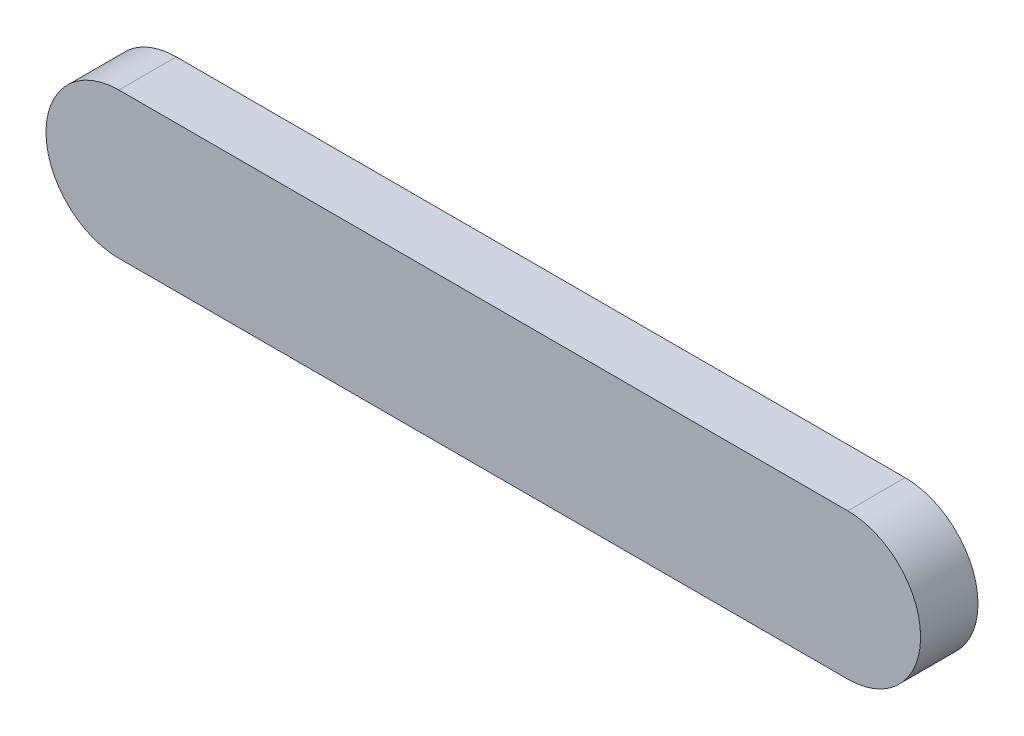
ISO-10303-21;
HEADER;
FILE_DESCRIPTION(('STEP AP214'),'2;1');
FILE_NAME('part.step','',(''),(''),'','','');
FILE_SCHEMA(('AUTOMOTIVE_DESIGN { 1 0 10303 214 1 1 1 1 }'));
ENDSEC;
DATA;
#1=APPLICATION_CONTEXT('core data for automotive mechanical design processes');
#2=APPLICATION_PROTOCOL_DEFINITION('international standard','automotive_design',2000,#1);
#3=PRODUCT_CONTEXT('',#1,'mechanical');
#4=PRODUCT('Part','Part','',(#3));
#5=PRODUCT_RELATED_PRODUCT_CATEGORY('part','',(#4));
#6=PRODUCT_DEFINITION_FORMATION('','',#4);
#7=PRODUCT_DEFINITION_CONTEXT('part definition',#1,'design');
#8=PRODUCT_DEFINITION('design','',#6,#7);
#9=PRODUCT_DEFINITION_SHAPE('','',#8);
#10=(LENGTH_UNIT() NAMED_UNIT(*) SI_UNIT(.MILLI.,.METRE.));
#11=(NAMED_UNIT(*) PLANE_ANGLE_UNIT() SI_UNIT($,.RADIAN.));
#12=(NAMED_UNIT(*) SI_UNIT($,.STERADIAN.) SOLID_ANGLE_UNIT());
#13=UNCERTAINTY_MEASURE_WITH_UNIT(LENGTH_MEASURE(1.E-05),#10,'distance_accuracy_value','');
#14=(GEOMETRIC_REPRESENTATION_CONTEXT(3) GLOBAL_UNCERTAINTY_ASSIGNED_CONTEXT((#13)) GLOBAL_UNIT_ASSIGNED_CONTEXT((#10,
#11,#12)) REPRESENTATION_CONTEXT('',''));
#15=CARTESIAN_POINT('',(0.,0.,0.));
#16=DIRECTION('',(0.,0.,1.));
#17=DIRECTION('',(1.,0.,0.));
#18=AXIS2_PLACEMENT_3D('',#15,#16,#17);
#19=CARTESIAN_POINT('',(92.64836944,66.04,0.));
#20=DIRECTION('',(0.,1.,0.));
#21=DIRECTION('',(1.,0.,0.));
#22=AXIS2_PLACEMENT_3D('',#19,#20,#21);
#23=PLANE('',#22);
#24=DIRECTION('',(1.,0.,0.));
#25=VECTOR('',#24,1.);
#26=CARTESIAN_POINT('',(92.64836944,66.04,0.1999996));
#27=LINE('',#26,#25);
#28=CARTESIAN_POINT('',(92.64836944,66.04,0.1999996));
#29=VERTEX_POINT('',#28);
#30=CARTESIAN_POINT('',(95.18836944,66.04,0.1999996));
#31=VERTEX_POINT('',#30);
#32=EDGE_CURVE('E11',#29,#31,#27,.T.);
#33=ORIENTED_EDGE('',*,*,#32,.F.);
#34=DIRECTION('',(0.,0.,1.));
#35=VECTOR('',#34,1.);
#36=CARTESIAN_POINT('',(92.64836944,66.04,0.));
#37=LINE('',#36,#35);
#38=CARTESIAN_POINT('',(92.64836944,66.04,0.));
#39=VERTEX_POINT('',#38);
#40=EDGE_CURVE('E24',#39,#29,#37,.T.);
#41=ORIENTED_EDGE('',*,*,#40,.F.);
#42=DIRECTION('',(1.,0.,0.));
#43=VECTOR('',#42,1.);
#44=CARTESIAN_POINT('',(92.64836944,66.04,0.));
#45=LINE('',#44,#43);
#46=CARTESIAN_POINT('',(95.18836944,66.04,0.));
#47=VERTEX_POINT('',#46);
#48=EDGE_CURVE('E75',#39,#47,#45,.T.);
#49=ORIENTED_EDGE('',*,*,#48,.T.);
#50=DIRECTION('',(0.,0.,1.));
#51=VECTOR('',#50,1.);
#52=CARTESIAN_POINT('',(95.18836944,66.04,0.));
#53=LINE('',#52,#51);
#54=EDGE_CURVE('E37',#47,#31,#53,.T.);
#55=ORIENTED_EDGE('',*,*,#54,.T.);
#56=EDGE_LOOP('',(#33,#41,#49,#55));
#57=FACE_BOUND('',#56,.T.);
#58=ADVANCED_FACE('F17',(#57),#23,.F.);
#59=CARTESIAN_POINT('',(95.18836944,66.294,0.));
#60=DIRECTION('',(0.,0.,-1.));
#61=DIRECTION('',(0.,-1.,0.));
#62=AXIS2_PLACEMENT_3D('',#59,#60,#61);
#63=CYLINDRICAL_SURFACE('',#62,0.254);
#64=CARTESIAN_POINT('',(95.18836944,66.294,0.1999996));
#65=DIRECTION('',(0.,0.,1.));
#66=DIRECTION('',(0.,-1.,0.));
#67=AXIS2_PLACEMENT_3D('',#64,#65,#66);
#68=CIRCLE('',#67,0.254);
#69=CARTESIAN_POINT('',(95.18836944,66.548,0.1999996));
#70=VERTEX_POINT('',#69);
#71=EDGE_CURVE('E83',#31,#70,#68,.T.);
#72=ORIENTED_EDGE('',*,*,#71,.F.);
#73=ORIENTED_EDGE('',*,*,#54,.F.);
#74=CARTESIAN_POINT('',(95.18836944,66.294,0.));
#75=DIRECTION('',(0.,0.,1.));
#76=DIRECTION('',(0.,-1.,0.));
#77=AXIS2_PLACEMENT_3D('',#74,#75,#76);
#78=CIRCLE('',#77,0.254);
#79=CARTESIAN_POINT('',(95.18836944,66.548,0.));
#80=VERTEX_POINT('',#79);
#81=EDGE_CURVE('E81',#47,#80,#78,.T.);
#82=ORIENTED_EDGE('',*,*,#81,.T.);
#83=DIRECTION('',(0.,0.,1.));
#84=VECTOR('',#83,1.);
#85=CARTESIAN_POINT('',(95.18836944,66.548,0.));
#86=LINE('',#85,#84);
#87=EDGE_CURVE('E67',#80,#70,#86,.T.);
#88=ORIENTED_EDGE('',*,*,#87,.T.);
#89=EDGE_LOOP('',(#72,#73,#82,#88));
#90=FACE_BOUND('',#89,.T.);
#91=ADVANCED_FACE('F89',(#90),#63,.T.);
#92=CARTESIAN_POINT('',(95.18836944,66.548,0.));
#93=DIRECTION('',(0.,-1.,0.));
#94=DIRECTION('',(-1.,0.,0.));
#95=AXIS2_PLACEMENT_3D('',#92,#93,#94);
#96=PLANE('',#95);
#97=DIRECTION('',(-1.,0.,0.));
#98=VECTOR('',#97,1.);
#99=CARTESIAN_POINT('',(95.18836944,66.548,0.1999996));
#100=LINE('',#99,#98);
#101=CARTESIAN_POINT('',(92.64836944,66.548,0.1999996));
#102=VERTEX_POINT('',#101);
#103=EDGE_CURVE('E71',#70,#102,#100,.T.);
#104=ORIENTED_EDGE('',*,*,#103,.F.);
#105=ORIENTED_EDGE('',*,*,#87,.F.);
#106=DIRECTION('',(-1.,0.,0.));
#107=VECTOR('',#106,1.);
#108=CARTESIAN_POINT('',(95.18836944,66.548,0.));
#109=LINE('',#108,#107);
#110=CARTESIAN_POINT('',(92.64836944,66.548,0.));
#111=VERTEX_POINT('',#110);
#112=EDGE_CURVE('E63',#80,#111,#109,.T.);
#113=ORIENTED_EDGE('',*,*,#112,.T.);
#114=DIRECTION('',(0.,0.,1.));
#115=VECTOR('',#114,1.);
#116=CARTESIAN_POINT('',(92.64836944,66.548,0.));
#117=LINE('',#116,#115);
#118=EDGE_CURVE('E53',#111,#102,#117,.T.);
#119=ORIENTED_EDGE('',*,*,#118,.T.);
#120=EDGE_LOOP('',(#104,#105,#113,#119));
#121=FACE_BOUND('',#120,.T.);
#122=ADVANCED_FACE('F66',(#121),#96,.F.);
#123=CARTESIAN_POINT('',(92.64836944,66.294,0.));
#124=DIRECTION('',(0.,0.,-1.));
#125=DIRECTION('',(0.,1.,0.));
#126=AXIS2_PLACEMENT_3D('',#123,#124,#125);
#127=CYLINDRICAL_SURFACE('',#126,0.254);
#128=CARTESIAN_POINT('',(92.64836944,66.294,0.1999996));
#129=DIRECTION('',(0.,0.,1.));
#130=DIRECTION('',(0.,1.,0.));
#131=AXIS2_PLACEMENT_3D('',#128,#129,#130);
#132=CIRCLE('',#131,0.254);
#133=EDGE_CURVE('E59',#102,#29,#132,.T.);
#134=ORIENTED_EDGE('',*,*,#133,.F.);
#135=ORIENTED_EDGE('',*,*,#118,.F.);
#136=CARTESIAN_POINT('',(92.64836944,66.294,0.));
#137=DIRECTION('',(0.,0.,1.));
#138=DIRECTION('',(0.,1.,0.));
#139=AXIS2_PLACEMENT_3D('',#136,#137,#138);
#140=CIRCLE('',#139,0.254);
#141=EDGE_CURVE('E57',#111,#39,#140,.T.);
#142=ORIENTED_EDGE('',*,*,#141,.T.);
#143=ORIENTED_EDGE('',*,*,#40,.T.);
#144=EDGE_LOOP('',(#134,#135,#142,#143));
#145=FACE_BOUND('',#144,.T.);
#146=ADVANCED_FACE('F55',(#145),#127,.T.);
#147=CARTESIAN_POINT('',(92.64836944,66.04,0.));
#148=DIRECTION('',(0.,0.,-1.));
#149=DIRECTION('',(-1.,0.,0.));
#150=AXIS2_PLACEMENT_3D('',#147,#148,#149);
#151=PLANE('',#150);
#152=ORIENTED_EDGE('',*,*,#141,.F.);
#153=ORIENTED_EDGE('',*,*,#112,.F.);
#154=ORIENTED_EDGE('',*,*,#81,.F.);
#155=ORIENTED_EDGE('',*,*,#48,.F.);
#156=EDGE_LOOP('',(#152,#153,#154,#155));
#157=FACE_BOUND('',#156,.T.);
#158=ADVANCED_FACE('F74',(#157),#151,.T.);
#159=CARTESIAN_POINT('',(92.64836944,66.04,0.1999996));
#160=DIRECTION('',(0.,0.,-1.));
#161=DIRECTION('',(-1.,0.,0.));
#162=AXIS2_PLACEMENT_3D('',#159,#160,#161);
#163=PLANE('',#162);
#164=ORIENTED_EDGE('',*,*,#32,.T.);
#165=ORIENTED_EDGE('',*,*,#71,.T.);
#166=ORIENTED_EDGE('',*,*,#103,.T.);
#167=ORIENTED_EDGE('',*,*,#133,.T.);
#168=EDGE_LOOP('',(#164,#165,#166,#167));
#169=FACE_BOUND('',#168,.T.);
#170=ADVANCED_FACE('F91',(#169),#163,.F.);
#171=CLOSED_SHELL('',(#58,#91,#122,#146,#158,#170));
#172=MANIFOLD_SOLID_BREP('B1',#171);
#173=ADVANCED_BREP_SHAPE_REPRESENTATION('',(#18,#172),#14);
#174=SHAPE_DEFINITION_REPRESENTATION(#9,#173);
ENDSEC;
END-ISO-10303-21;
